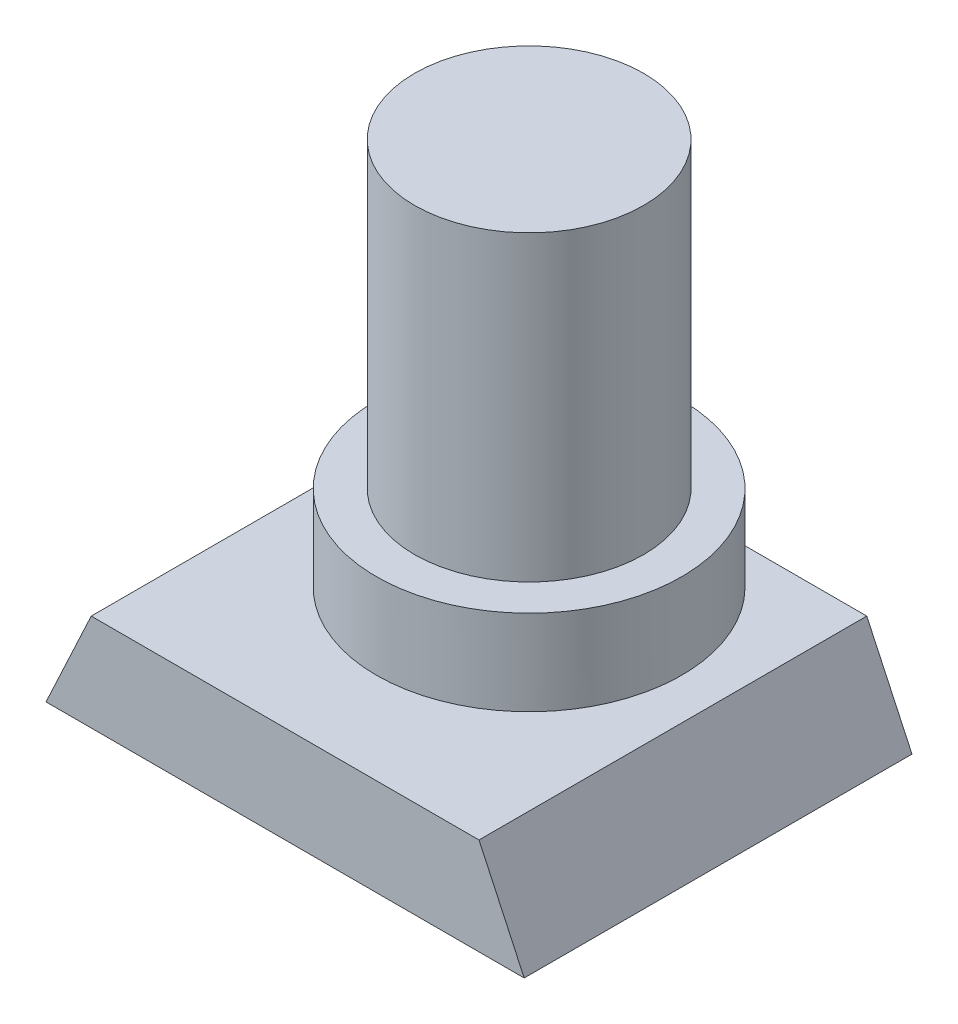
ISO-10303-21;
HEADER;
FILE_DESCRIPTION(('STEP AP214'),'2;1');
FILE_NAME('part.step','',(''),(''),'','','');
FILE_SCHEMA(('AUTOMOTIVE_DESIGN { 1 0 10303 214 1 1 1 1 }'));
ENDSEC;
DATA;
#1=APPLICATION_CONTEXT('core data for automotive mechanical design processes');
#2=APPLICATION_PROTOCOL_DEFINITION('international standard','automotive_design',2000,#1);
#3=PRODUCT_CONTEXT('',#1,'mechanical');
#4=PRODUCT('Part','Part','',(#3));
#5=PRODUCT_RELATED_PRODUCT_CATEGORY('part','',(#4));
#6=PRODUCT_DEFINITION_FORMATION('','',#4);
#7=PRODUCT_DEFINITION_CONTEXT('part definition',#1,'design');
#8=PRODUCT_DEFINITION('design','',#6,#7);
#9=PRODUCT_DEFINITION_SHAPE('','',#8);
#10=(LENGTH_UNIT() NAMED_UNIT(*) SI_UNIT(.MILLI.,.METRE.));
#11=(NAMED_UNIT(*) PLANE_ANGLE_UNIT() SI_UNIT($,.RADIAN.));
#12=(NAMED_UNIT(*) SI_UNIT($,.STERADIAN.) SOLID_ANGLE_UNIT());
#13=UNCERTAINTY_MEASURE_WITH_UNIT(LENGTH_MEASURE(1.E-05),#10,'distance_accuracy_value','');
#14=(GEOMETRIC_REPRESENTATION_CONTEXT(3) GLOBAL_UNCERTAINTY_ASSIGNED_CONTEXT((#13)) GLOBAL_UNIT_ASSIGNED_CONTEXT((#10,
#11,#12)) REPRESENTATION_CONTEXT('',''));
#15=CARTESIAN_POINT('',(0.,0.,0.));
#16=DIRECTION('',(0.,0.,1.));
#17=DIRECTION('',(1.,0.,0.));
#18=AXIS2_PLACEMENT_3D('',#15,#16,#17);
#19=CARTESIAN_POINT('',(-6.35,3.175,12.7));
#20=DIRECTION('',(0.906307787036648,-0.422618261740704,0.));
#21=DIRECTION('',(0.422618261740704,0.906307787036648,0.));
#22=AXIS2_PLACEMENT_3D('',#19,#20,#21);
#23=PLANE('',#22);
#24=DIRECTION('',(-0.422618261740704,-0.906307787036648,0.));
#25=VECTOR('',#24,1.);
#26=CARTESIAN_POINT('',(-6.35,3.175,0.));
#27=LINE('',#26,#25);
#28=CARTESIAN_POINT('',(-6.35,3.175,0.));
#29=VERTEX_POINT('',#28);
#30=CARTESIAN_POINT('',(-7.83052681464214,0.,0.));
#31=VERTEX_POINT('',#30);
#32=EDGE_CURVE('E96',#29,#31,#27,.T.);
#33=ORIENTED_EDGE('',*,*,#32,.T.);
#34=DIRECTION('',(0.,0.,-1.));
#35=VECTOR('',#34,1.);
#36=CARTESIAN_POINT('',(-7.83052681464214,0.,12.7));
#37=LINE('',#36,#35);
#38=CARTESIAN_POINT('',(-7.83052681464214,0.,12.7));
#39=VERTEX_POINT('',#38);
#40=EDGE_CURVE('E12',#39,#31,#37,.T.);
#41=ORIENTED_EDGE('',*,*,#40,.F.);
#42=DIRECTION('',(-0.422618261740704,-0.906307787036648,0.));
#43=VECTOR('',#42,1.);
#44=CARTESIAN_POINT('',(-6.35,3.175,12.7));
#45=LINE('',#44,#43);
#46=CARTESIAN_POINT('',(-6.35,3.175,12.7));
#47=VERTEX_POINT('',#46);
#48=EDGE_CURVE('E121',#47,#39,#45,.T.);
#49=ORIENTED_EDGE('',*,*,#48,.F.);
#50=DIRECTION('',(0.,0.,-1.));
#51=VECTOR('',#50,1.);
#52=CARTESIAN_POINT('',(-6.35,3.175,12.7));
#53=LINE('',#52,#51);
#54=EDGE_CURVE('E127',#47,#29,#53,.T.);
#55=ORIENTED_EDGE('',*,*,#54,.T.);
#56=EDGE_LOOP('',(#33,#41,#49,#55));
#57=FACE_BOUND('',#56,.T.);
#58=ADVANCED_FACE('F40',(#57),#23,.F.);
#59=CARTESIAN_POINT('',(-7.83052681464214,0.,12.7));
#60=DIRECTION('',(0.,1.,0.));
#61=DIRECTION('',(0.,0.,1.));
#62=AXIS2_PLACEMENT_3D('',#59,#60,#61);
#63=PLANE('',#62);
#64=DIRECTION('',(1.,0.,0.));
#65=VECTOR('',#64,1.);
#66=CARTESIAN_POINT('',(-7.83052681464214,0.,0.));
#67=LINE('',#66,#65);
#68=CARTESIAN_POINT('',(7.83052681464214,0.,0.));
#69=VERTEX_POINT('',#68);
#70=EDGE_CURVE('E129',#31,#69,#67,.T.);
#71=ORIENTED_EDGE('',*,*,#70,.T.);
#72=DIRECTION('',(0.,0.,-1.));
#73=VECTOR('',#72,1.);
#74=CARTESIAN_POINT('',(7.83052681464214,0.,12.7));
#75=LINE('',#74,#73);
#76=CARTESIAN_POINT('',(7.83052681464214,0.,12.7));
#77=VERTEX_POINT('',#76);
#78=EDGE_CURVE('E48',#77,#69,#75,.T.);
#79=ORIENTED_EDGE('',*,*,#78,.F.);
#80=DIRECTION('',(1.,0.,0.));
#81=VECTOR('',#80,1.);
#82=CARTESIAN_POINT('',(-7.83052681464214,0.,12.7));
#83=LINE('',#82,#81);
#84=EDGE_CURVE('E91',#39,#77,#83,.T.);
#85=ORIENTED_EDGE('',*,*,#84,.F.);
#86=ORIENTED_EDGE('',*,*,#40,.T.);
#87=EDGE_LOOP('',(#71,#79,#85,#86));
#88=FACE_BOUND('',#87,.T.);
#89=ADVANCED_FACE('F142',(#88),#63,.F.);
#90=CARTESIAN_POINT('',(7.83052681464214,0.,12.7));
#91=DIRECTION('',(-0.906307787036648,-0.422618261740704,0.));
#92=DIRECTION('',(0.422618261740704,-0.906307787036648,0.));
#93=AXIS2_PLACEMENT_3D('',#90,#91,#92);
#94=PLANE('',#93);
#95=DIRECTION('',(-0.422618261740704,0.906307787036648,0.));
#96=VECTOR('',#95,1.);
#97=CARTESIAN_POINT('',(7.83052681464214,0.,0.));
#98=LINE('',#97,#96);
#99=CARTESIAN_POINT('',(6.35,3.175,0.));
#100=VERTEX_POINT('',#99);
#101=EDGE_CURVE('E98',#69,#100,#98,.T.);
#102=ORIENTED_EDGE('',*,*,#101,.T.);
#103=DIRECTION('',(0.,0.,-1.));
#104=VECTOR('',#103,1.);
#105=CARTESIAN_POINT('',(6.35,3.175,12.7));
#106=LINE('',#105,#104);
#107=CARTESIAN_POINT('',(6.35,3.175,12.7));
#108=VERTEX_POINT('',#107);
#109=EDGE_CURVE('E133',#108,#100,#106,.T.);
#110=ORIENTED_EDGE('',*,*,#109,.F.);
#111=DIRECTION('',(-0.422618261740704,0.906307787036648,0.));
#112=VECTOR('',#111,1.);
#113=CARTESIAN_POINT('',(7.83052681464214,0.,12.7));
#114=LINE('',#113,#112);
#115=EDGE_CURVE('E124',#77,#108,#114,.T.);
#116=ORIENTED_EDGE('',*,*,#115,.F.);
#117=ORIENTED_EDGE('',*,*,#78,.T.);
#118=EDGE_LOOP('',(#102,#110,#116,#117));
#119=FACE_BOUND('',#118,.T.);
#120=ADVANCED_FACE('F139',(#119),#94,.F.);
#121=CARTESIAN_POINT('',(6.35,3.175,12.7));
#122=DIRECTION('',(0.,-1.,0.));
#123=DIRECTION('',(0.,0.,-1.));
#124=AXIS2_PLACEMENT_3D('',#121,#122,#123);
#125=PLANE('',#124);
#126=CARTESIAN_POINT('',(0.,3.175,4.70881853445393));
#127=DIRECTION('',(0.,1.,0.));
#128=DIRECTION('',(0.,0.,1.));
#129=AXIS2_PLACEMENT_3D('',#126,#127,#128);
#130=CIRCLE('',#129,5.);
#131=CARTESIAN_POINT('',(-1.68137681962823,3.175,0.));
#132=VERTEX_POINT('',#131);
#133=CARTESIAN_POINT('',(1.68137681962823,3.175,0.));
#134=VERTEX_POINT('',#133);
#135=EDGE_CURVE('E101',#132,#134,#130,.T.);
#136=ORIENTED_EDGE('',*,*,#135,.F.);
#137=DIRECTION('',(-1.,0.,0.));
#138=VECTOR('',#137,1.);
#139=CARTESIAN_POINT('',(6.35,3.175,0.));
#140=LINE('',#139,#138);
#141=EDGE_CURVE('E84',#132,#29,#140,.T.);
#142=ORIENTED_EDGE('',*,*,#141,.T.);
#143=ORIENTED_EDGE('',*,*,#54,.F.);
#144=DIRECTION('',(-1.,0.,0.));
#145=VECTOR('',#144,1.);
#146=CARTESIAN_POINT('',(6.35,3.175,12.7));
#147=LINE('',#146,#145);
#148=EDGE_CURVE('E64',#108,#47,#147,.T.);
#149=ORIENTED_EDGE('',*,*,#148,.F.);
#150=ORIENTED_EDGE('',*,*,#109,.T.);
#151=EDGE_CURVE('E97',#100,#134,#140,.T.);
#152=ORIENTED_EDGE('',*,*,#151,.T.);
#153=EDGE_LOOP('',(#136,#142,#143,#149,#150,#152));
#154=FACE_BOUND('',#153,.T.);
#155=ADVANCED_FACE('F102',(#154),#125,.F.);
#156=CARTESIAN_POINT('',(0.,0.,12.7));
#157=DIRECTION('',(0.,0.,1.));
#158=DIRECTION('',(1.,0.,0.));
#159=AXIS2_PLACEMENT_3D('',#156,#157,#158);
#160=PLANE('',#159);
#161=ORIENTED_EDGE('',*,*,#48,.T.);
#162=ORIENTED_EDGE('',*,*,#84,.T.);
#163=ORIENTED_EDGE('',*,*,#115,.T.);
#164=ORIENTED_EDGE('',*,*,#148,.T.);
#165=EDGE_LOOP('',(#161,#162,#163,#164));
#166=FACE_BOUND('',#165,.T.);
#167=ADVANCED_FACE('F145',(#166),#160,.T.);
#168=CARTESIAN_POINT('',(0.,0.,0.));
#169=DIRECTION('',(0.,0.,1.));
#170=DIRECTION('',(1.,0.,0.));
#171=AXIS2_PLACEMENT_3D('',#168,#169,#170);
#172=PLANE('',#171);
#173=ORIENTED_EDGE('',*,*,#32,.F.);
#174=ORIENTED_EDGE('',*,*,#141,.F.);
#175=DIRECTION('',(-1.,0.,0.));
#176=VECTOR('',#175,1.);
#177=CARTESIAN_POINT('',(0.,3.175,0.));
#178=LINE('',#177,#176);
#179=EDGE_CURVE('E55',#134,#132,#178,.T.);
#180=ORIENTED_EDGE('',*,*,#179,.F.);
#181=ORIENTED_EDGE('',*,*,#151,.F.);
#182=ORIENTED_EDGE('',*,*,#101,.F.);
#183=ORIENTED_EDGE('',*,*,#70,.F.);
#184=EDGE_LOOP('',(#173,#174,#180,#181,#182,#183));
#185=FACE_BOUND('',#184,.T.);
#186=ADVANCED_FACE('F94',(#185),#172,.F.);
#187=CARTESIAN_POINT('',(0.,20.3671356237313,4.70881853445393));
#188=DIRECTION('',(0.,-1.,0.));
#189=DIRECTION('',(0.,0.,-1.));
#190=AXIS2_PLACEMENT_3D('',#187,#188,#189);
#191=CYLINDRICAL_SURFACE('',#190,5.);
#192=EDGE_CURVE('E107',#134,#132,#130,.T.);
#193=ORIENTED_EDGE('',*,*,#192,.T.);
#194=ORIENTED_EDGE('',*,*,#135,.T.);
#195=EDGE_LOOP('',(#193,#194));
#196=FACE_BOUND('',#195,.T.);
#197=CARTESIAN_POINT('',(0.,5.97100000000031,4.70881853445393));
#198=DIRECTION('',(0.,1.,0.));
#199=DIRECTION('',(-1.,0.,0.));
#200=AXIS2_PLACEMENT_3D('',#197,#198,#199);
#201=CIRCLE('',#200,5.);
#202=CARTESIAN_POINT('',(-5.,5.97100000000031,4.70881853445393));
#203=VERTEX_POINT('',#202);
#204=EDGE_CURVE('E115',#203,#203,#201,.T.);
#205=ORIENTED_EDGE('',*,*,#204,.F.);
#206=EDGE_LOOP('',(#205));
#207=FACE_BOUND('',#206,.T.);
#208=ADVANCED_FACE('F113',(#196,#207),#191,.T.);
#209=CARTESIAN_POINT('',(0.,3.175,4.70881853445393));
#210=DIRECTION('',(0.,1.,0.));
#211=DIRECTION('',(0.,0.,1.));
#212=AXIS2_PLACEMENT_3D('',#209,#210,#211);
#213=PLANE('',#212);
#214=ORIENTED_EDGE('',*,*,#192,.F.);
#215=ORIENTED_EDGE('',*,*,#179,.T.);
#216=EDGE_LOOP('',(#214,#215));
#217=FACE_BOUND('',#216,.T.);
#218=ADVANCED_FACE('F110',(#217),#213,.F.);
#219=CARTESIAN_POINT('',(0.,5.97100000000031,4.70881853445393));
#220=DIRECTION('',(0.,1.,0.));
#221=DIRECTION('',(0.577413011779187,0.,-0.816452211600954));
#222=AXIS2_PLACEMENT_3D('',#219,#220,#221);
#223=PLANE('',#222);
#224=CARTESIAN_POINT('',(0.,5.97100000000031,4.70881853445358));
#225=DIRECTION('',(0.,1.,0.));
#226=DIRECTION('',(-1.,0.,0.));
#227=AXIS2_PLACEMENT_3D('',#224,#225,#226);
#228=CIRCLE('',#227,3.75);
#229=CARTESIAN_POINT('',(-3.75,5.97100000000031,4.70881853445358));
#230=VERTEX_POINT('',#229);
#231=EDGE_CURVE('E43',#230,#230,#228,.T.);
#232=ORIENTED_EDGE('',*,*,#231,.F.);
#233=EDGE_LOOP('',(#232));
#234=FACE_BOUND('',#233,.T.);
#235=ORIENTED_EDGE('',*,*,#204,.T.);
#236=EDGE_LOOP('',(#235));
#237=FACE_BOUND('',#236,.T.);
#238=ADVANCED_FACE('F206',(#234,#237),#223,.T.);
#239=CARTESIAN_POINT('',(0.,15.875,4.70881853445358));
#240=DIRECTION('',(0.,1.,0.));
#241=DIRECTION('',(0.,0.,1.));
#242=AXIS2_PLACEMENT_3D('',#239,#240,#241);
#243=PLANE('',#242);
#244=CARTESIAN_POINT('',(0.,15.875,4.70881853445358));
#245=DIRECTION('',(0.,1.,0.));
#246=DIRECTION('',(0.,0.,1.));
#247=AXIS2_PLACEMENT_3D('',#244,#245,#246);
#248=CIRCLE('',#247,3.75);
#249=CARTESIAN_POINT('',(0.,15.875,8.45881853445358));
#250=VERTEX_POINT('',#249);
#251=EDGE_CURVE('E111',#250,#250,#248,.T.);
#252=ORIENTED_EDGE('',*,*,#251,.T.);
#253=EDGE_LOOP('',(#252));
#254=FACE_BOUND('',#253,.T.);
#255=ADVANCED_FACE('F197',(#254),#243,.T.);
#256=CARTESIAN_POINT('',(0.,15.875,4.70881853445358));
#257=DIRECTION('',(0.,-1.,0.));
#258=DIRECTION('',(0.,0.,-1.));
#259=AXIS2_PLACEMENT_3D('',#256,#257,#258);
#260=CYLINDRICAL_SURFACE('',#259,3.75);
#261=ORIENTED_EDGE('',*,*,#231,.T.);
#262=EDGE_LOOP('',(#261));
#263=FACE_BOUND('',#262,.T.);
#264=ORIENTED_EDGE('',*,*,#251,.F.);
#265=EDGE_LOOP('',(#264));
#266=FACE_BOUND('',#265,.T.);
#267=ADVANCED_FACE('F192',(#263,#266),#260,.T.);
#268=CLOSED_SHELL('',(#58,#89,#120,#155,#167,#186,#208,#218,#238,#255,#267));
#269=MANIFOLD_SOLID_BREP('B2',#268);
#270=ADVANCED_BREP_SHAPE_REPRESENTATION('',(#18,#269),#14);
#271=SHAPE_DEFINITION_REPRESENTATION(#9,#270);
ENDSEC;
END-ISO-10303-21;
